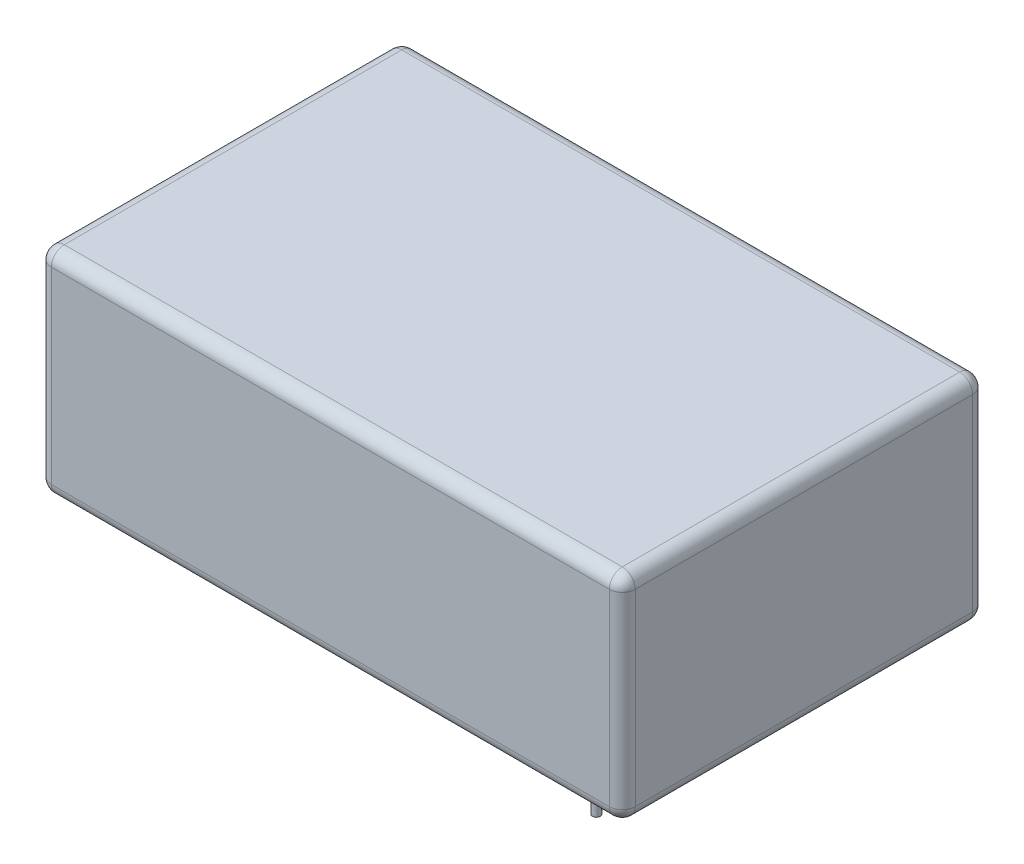
ISO-10303-21;
HEADER;
FILE_DESCRIPTION(('STEP AP214'),'2;1');
FILE_NAME('part.step','',(''),(''),'','','');
FILE_SCHEMA(('AUTOMOTIVE_DESIGN { 1 0 10303 214 1 1 1 1 }'));
ENDSEC;
DATA;
#1=APPLICATION_CONTEXT('core data for automotive mechanical design processes');
#2=APPLICATION_PROTOCOL_DEFINITION('international standard','automotive_design',2000,#1);
#3=PRODUCT_CONTEXT('',#1,'mechanical');
#4=PRODUCT('Part','Part','',(#3));
#5=PRODUCT_RELATED_PRODUCT_CATEGORY('part','',(#4));
#6=PRODUCT_DEFINITION_FORMATION('','',#4);
#7=PRODUCT_DEFINITION_CONTEXT('part definition',#1,'design');
#8=PRODUCT_DEFINITION('design','',#6,#7);
#9=PRODUCT_DEFINITION_SHAPE('','',#8);
#10=(LENGTH_UNIT() NAMED_UNIT(*) SI_UNIT(.MILLI.,.METRE.));
#11=(NAMED_UNIT(*) PLANE_ANGLE_UNIT() SI_UNIT($,.RADIAN.));
#12=(NAMED_UNIT(*) SI_UNIT($,.STERADIAN.) SOLID_ANGLE_UNIT());
#13=UNCERTAINTY_MEASURE_WITH_UNIT(LENGTH_MEASURE(1.E-05),#10,'distance_accuracy_value','');
#14=(GEOMETRIC_REPRESENTATION_CONTEXT(3) GLOBAL_UNCERTAINTY_ASSIGNED_CONTEXT((#13)) GLOBAL_UNIT_ASSIGNED_CONTEXT((#10,
#11,#12)) REPRESENTATION_CONTEXT('',''));
#15=CARTESIAN_POINT('',(0.,0.,0.));
#16=DIRECTION('',(0.,0.,1.));
#17=DIRECTION('',(1.,0.,0.));
#18=AXIS2_PLACEMENT_3D('',#15,#16,#17);
#19=CARTESIAN_POINT('',(0.,0.,28.));
#20=DIRECTION('',(1.,0.,0.));
#21=DIRECTION('',(0.,0.,-1.));
#22=AXIS2_PLACEMENT_3D('',#19,#20,#21);
#23=PLANE('',#22);
#24=DIRECTION('',(0.,-1.,0.));
#25=VECTOR('',#24,1.);
#26=CARTESIAN_POINT('',(0.,0.,1.));
#27=LINE('',#26,#25);
#28=CARTESIAN_POINT('',(0.,15.5,1.));
#29=VERTEX_POINT('',#28);
#30=CARTESIAN_POINT('',(0.,1.,1.));
#31=VERTEX_POINT('',#30);
#32=EDGE_CURVE('E234',#29,#31,#27,.T.);
#33=ORIENTED_EDGE('',*,*,#32,.T.);
#34=DIRECTION('',(0.,0.,-1.));
#35=VECTOR('',#34,1.);
#36=CARTESIAN_POINT('',(0.,1.,28.));
#37=LINE('',#36,#35);
#38=CARTESIAN_POINT('',(0.,1.,27.));
#39=VERTEX_POINT('',#38);
#40=EDGE_CURVE('E237',#31,#39,#37,.F.);
#41=ORIENTED_EDGE('',*,*,#40,.T.);
#42=DIRECTION('',(0.,-1.,0.));
#43=VECTOR('',#42,1.);
#44=CARTESIAN_POINT('',(0.,0.,27.));
#45=LINE('',#44,#43);
#46=CARTESIAN_POINT('',(0.,15.5,27.));
#47=VERTEX_POINT('',#46);
#48=EDGE_CURVE('E231',#39,#47,#45,.F.);
#49=ORIENTED_EDGE('',*,*,#48,.T.);
#50=DIRECTION('',(0.,0.,-1.));
#51=VECTOR('',#50,1.);
#52=CARTESIAN_POINT('',(0.,15.5,28.));
#53=LINE('',#52,#51);
#54=EDGE_CURVE('E228',#47,#29,#53,.T.);
#55=ORIENTED_EDGE('',*,*,#54,.T.);
#56=EDGE_LOOP('',(#33,#41,#49,#55));
#57=FACE_BOUND('',#56,.T.);
#58=ADVANCED_FACE('F37',(#57),#23,.F.);
#59=CARTESIAN_POINT('',(0.,0.,28.));
#60=DIRECTION('',(0.,1.,0.));
#61=DIRECTION('',(0.,0.,1.));
#62=AXIS2_PLACEMENT_3D('',#59,#60,#61);
#63=PLANE('',#62);
#64=CARTESIAN_POINT('',(6.,0.,19.));
#65=DIRECTION('',(0.,1.,0.));
#66=DIRECTION('',(0.,0.,1.));
#67=AXIS2_PLACEMENT_3D('',#64,#65,#66);
#68=CIRCLE('',#67,1.3);
#69=CARTESIAN_POINT('',(6.,0.,20.3));
#70=VERTEX_POINT('',#69);
#71=EDGE_CURVE('E188',#70,#70,#68,.T.);
#72=ORIENTED_EDGE('',*,*,#71,.T.);
#73=EDGE_LOOP('',(#72));
#74=FACE_BOUND('',#73,.T.);
#75=CARTESIAN_POINT('',(6.,0.,9.));
#76=DIRECTION('',(0.,1.,0.));
#77=DIRECTION('',(0.,0.,1.));
#78=AXIS2_PLACEMENT_3D('',#75,#76,#77);
#79=CIRCLE('',#78,1.3);
#80=CARTESIAN_POINT('',(6.,0.,10.3));
#81=VERTEX_POINT('',#80);
#82=EDGE_CURVE('E184',#81,#81,#79,.T.);
#83=ORIENTED_EDGE('',*,*,#82,.T.);
#84=EDGE_LOOP('',(#83));
#85=FACE_BOUND('',#84,.T.);
#86=CARTESIAN_POINT('',(39.,0.,24.));
#87=DIRECTION('',(0.,1.,0.));
#88=DIRECTION('',(0.,0.,1.));
#89=AXIS2_PLACEMENT_3D('',#86,#87,#88);
#90=CIRCLE('',#89,1.3);
#91=CARTESIAN_POINT('',(39.,0.,25.3));
#92=VERTEX_POINT('',#91);
#93=EDGE_CURVE('E175',#92,#92,#90,.T.);
#94=ORIENTED_EDGE('',*,*,#93,.T.);
#95=EDGE_LOOP('',(#94));
#96=FACE_BOUND('',#95,.T.);
#97=CARTESIAN_POINT('',(39.,0.,4.));
#98=DIRECTION('',(0.,1.,0.));
#99=DIRECTION('',(0.,0.,1.));
#100=AXIS2_PLACEMENT_3D('',#97,#98,#99);
#101=CIRCLE('',#100,1.3);
#102=CARTESIAN_POINT('',(39.,0.,5.3));
#103=VERTEX_POINT('',#102);
#104=EDGE_CURVE('E169',#103,#103,#101,.T.);
#105=ORIENTED_EDGE('',*,*,#104,.T.);
#106=EDGE_LOOP('',(#105));
#107=FACE_BOUND('',#106,.T.);
#108=DIRECTION('',(1.,0.,0.));
#109=VECTOR('',#108,1.);
#110=CARTESIAN_POINT('',(45.,0.,1.));
#111=LINE('',#110,#109);
#112=CARTESIAN_POINT('',(1.,0.,1.));
#113=VERTEX_POINT('',#112);
#114=CARTESIAN_POINT('',(44.,0.,1.));
#115=VERTEX_POINT('',#114);
#116=EDGE_CURVE('E166',#113,#115,#111,.T.);
#117=ORIENTED_EDGE('',*,*,#116,.T.);
#118=DIRECTION('',(0.,0.,-1.));
#119=VECTOR('',#118,1.);
#120=CARTESIAN_POINT('',(44.,0.,28.));
#121=LINE('',#120,#119);
#122=CARTESIAN_POINT('',(44.,0.,27.));
#123=VERTEX_POINT('',#122);
#124=EDGE_CURVE('E132',#115,#123,#121,.F.);
#125=ORIENTED_EDGE('',*,*,#124,.T.);
#126=DIRECTION('',(1.,0.,0.));
#127=VECTOR('',#126,1.);
#128=CARTESIAN_POINT('',(0.,0.,27.));
#129=LINE('',#128,#127);
#130=CARTESIAN_POINT('',(1.,0.,27.));
#131=VERTEX_POINT('',#130);
#132=EDGE_CURVE('E154',#123,#131,#129,.F.);
#133=ORIENTED_EDGE('',*,*,#132,.T.);
#134=DIRECTION('',(0.,0.,-1.));
#135=VECTOR('',#134,1.);
#136=CARTESIAN_POINT('',(1.,0.,28.));
#137=LINE('',#136,#135);
#138=EDGE_CURVE('E161',#131,#113,#137,.T.);
#139=ORIENTED_EDGE('',*,*,#138,.T.);
#140=EDGE_LOOP('',(#117,#125,#133,#139));
#141=FACE_BOUND('',#140,.T.);
#142=ADVANCED_FACE('F164',(#74,#85,#96,#107,#141),#63,.F.);
#143=CARTESIAN_POINT('',(45.,0.,28.));
#144=DIRECTION('',(-1.,0.,0.));
#145=DIRECTION('',(0.,0.,1.));
#146=AXIS2_PLACEMENT_3D('',#143,#144,#145);
#147=PLANE('',#146);
#148=DIRECTION('',(0.,1.,0.));
#149=VECTOR('',#148,1.);
#150=CARTESIAN_POINT('',(45.,0.,27.));
#151=LINE('',#150,#149);
#152=CARTESIAN_POINT('',(45.,15.5,27.));
#153=VERTEX_POINT('',#152);
#154=CARTESIAN_POINT('',(45.,1.,27.));
#155=VERTEX_POINT('',#154);
#156=EDGE_CURVE('E207',#153,#155,#151,.F.);
#157=ORIENTED_EDGE('',*,*,#156,.T.);
#158=DIRECTION('',(0.,0.,-1.));
#159=VECTOR('',#158,1.);
#160=CARTESIAN_POINT('',(45.,1.,28.));
#161=LINE('',#160,#159);
#162=CARTESIAN_POINT('',(45.,1.,1.));
#163=VERTEX_POINT('',#162);
#164=EDGE_CURVE('E135',#155,#163,#161,.T.);
#165=ORIENTED_EDGE('',*,*,#164,.T.);
#166=DIRECTION('',(0.,1.,0.));
#167=VECTOR('',#166,1.);
#168=CARTESIAN_POINT('',(45.,16.5,1.));
#169=LINE('',#168,#167);
#170=CARTESIAN_POINT('',(45.,15.5,1.));
#171=VERTEX_POINT('',#170);
#172=EDGE_CURVE('E210',#163,#171,#169,.T.);
#173=ORIENTED_EDGE('',*,*,#172,.T.);
#174=DIRECTION('',(0.,0.,-1.));
#175=VECTOR('',#174,1.);
#176=CARTESIAN_POINT('',(45.,15.5,28.));
#177=LINE('',#176,#175);
#178=EDGE_CURVE('E204',#171,#153,#177,.F.);
#179=ORIENTED_EDGE('',*,*,#178,.T.);
#180=EDGE_LOOP('',(#157,#165,#173,#179));
#181=FACE_BOUND('',#180,.T.);
#182=ADVANCED_FACE('F383',(#181),#147,.F.);
#183=CARTESIAN_POINT('',(0.,16.5,28.));
#184=DIRECTION('',(0.,-1.,0.));
#185=DIRECTION('',(0.,0.,-1.));
#186=AXIS2_PLACEMENT_3D('',#183,#184,#185);
#187=PLANE('',#186);
#188=DIRECTION('',(-1.,0.,0.));
#189=VECTOR('',#188,1.);
#190=CARTESIAN_POINT('',(0.,16.5,27.));
#191=LINE('',#190,#189);
#192=CARTESIAN_POINT('',(1.,16.5,27.));
#193=VERTEX_POINT('',#192);
#194=CARTESIAN_POINT('',(44.,16.5,27.));
#195=VERTEX_POINT('',#194);
#196=EDGE_CURVE('E47',#193,#195,#191,.F.);
#197=ORIENTED_EDGE('',*,*,#196,.T.);
#198=DIRECTION('',(0.,0.,-1.));
#199=VECTOR('',#198,1.);
#200=CARTESIAN_POINT('',(44.,16.5,28.));
#201=LINE('',#200,#199);
#202=CARTESIAN_POINT('',(44.,16.5,1.));
#203=VERTEX_POINT('',#202);
#204=EDGE_CURVE('E11',#195,#203,#201,.T.);
#205=ORIENTED_EDGE('',*,*,#204,.T.);
#206=DIRECTION('',(-1.,0.,0.));
#207=VECTOR('',#206,1.);
#208=CARTESIAN_POINT('',(0.,16.5,1.));
#209=LINE('',#208,#207);
#210=CARTESIAN_POINT('',(1.,16.5,1.));
#211=VERTEX_POINT('',#210);
#212=EDGE_CURVE('E253',#203,#211,#209,.T.);
#213=ORIENTED_EDGE('',*,*,#212,.T.);
#214=DIRECTION('',(0.,0.,-1.));
#215=VECTOR('',#214,1.);
#216=CARTESIAN_POINT('',(1.,16.5,28.));
#217=LINE('',#216,#215);
#218=EDGE_CURVE('E58',#211,#193,#217,.F.);
#219=ORIENTED_EDGE('',*,*,#218,.T.);
#220=EDGE_LOOP('',(#197,#205,#213,#219));
#221=FACE_BOUND('',#220,.T.);
#222=ADVANCED_FACE('F468',(#221),#187,.F.);
#223=CARTESIAN_POINT('',(0.,0.,28.));
#224=DIRECTION('',(0.,0.,-1.));
#225=DIRECTION('',(-1.,0.,0.));
#226=AXIS2_PLACEMENT_3D('',#223,#224,#225);
#227=PLANE('',#226);
#228=DIRECTION('',(1.,0.,0.));
#229=VECTOR('',#228,1.);
#230=CARTESIAN_POINT('',(0.,1.,28.));
#231=LINE('',#230,#229);
#232=CARTESIAN_POINT('',(1.,1.,28.));
#233=VERTEX_POINT('',#232);
#234=CARTESIAN_POINT('',(44.,1.,28.));
#235=VERTEX_POINT('',#234);
#236=EDGE_CURVE('E246',#233,#235,#231,.T.);
#237=ORIENTED_EDGE('',*,*,#236,.T.);
#238=DIRECTION('',(0.,1.,0.));
#239=VECTOR('',#238,1.);
#240=CARTESIAN_POINT('',(44.,0.,28.));
#241=LINE('',#240,#239);
#242=CARTESIAN_POINT('',(44.,15.5,28.));
#243=VERTEX_POINT('',#242);
#244=EDGE_CURVE('E249',#235,#243,#241,.T.);
#245=ORIENTED_EDGE('',*,*,#244,.T.);
#246=DIRECTION('',(-1.,0.,0.));
#247=VECTOR('',#246,1.);
#248=CARTESIAN_POINT('',(0.,15.5,28.));
#249=LINE('',#248,#247);
#250=CARTESIAN_POINT('',(1.,15.5,28.));
#251=VERTEX_POINT('',#250);
#252=EDGE_CURVE('E241',#243,#251,#249,.T.);
#253=ORIENTED_EDGE('',*,*,#252,.T.);
#254=DIRECTION('',(0.,-1.,0.));
#255=VECTOR('',#254,1.);
#256=CARTESIAN_POINT('',(1.,0.,28.));
#257=LINE('',#256,#255);
#258=EDGE_CURVE('E244',#251,#233,#257,.T.);
#259=ORIENTED_EDGE('',*,*,#258,.T.);
#260=EDGE_LOOP('',(#237,#245,#253,#259));
#261=FACE_BOUND('',#260,.T.);
#262=ADVANCED_FACE('F391',(#261),#227,.F.);
#263=CARTESIAN_POINT('',(0.,0.,0.));
#264=DIRECTION('',(0.,0.,-1.));
#265=DIRECTION('',(-1.,0.,0.));
#266=AXIS2_PLACEMENT_3D('',#263,#264,#265);
#267=PLANE('',#266);
#268=DIRECTION('',(0.,1.,0.));
#269=VECTOR('',#268,1.);
#270=CARTESIAN_POINT('',(44.,0.,0.));
#271=LINE('',#270,#269);
#272=CARTESIAN_POINT('',(44.,15.5,0.));
#273=VERTEX_POINT('',#272);
#274=CARTESIAN_POINT('',(44.,1.,0.));
#275=VERTEX_POINT('',#274);
#276=EDGE_CURVE('E221',#273,#275,#271,.F.);
#277=ORIENTED_EDGE('',*,*,#276,.T.);
#278=DIRECTION('',(1.,0.,0.));
#279=VECTOR('',#278,1.);
#280=CARTESIAN_POINT('',(0.,1.,0.));
#281=LINE('',#280,#279);
#282=CARTESIAN_POINT('',(1.,1.,0.));
#283=VERTEX_POINT('',#282);
#284=EDGE_CURVE('E224',#275,#283,#281,.F.);
#285=ORIENTED_EDGE('',*,*,#284,.T.);
#286=DIRECTION('',(0.,-1.,0.));
#287=VECTOR('',#286,1.);
#288=CARTESIAN_POINT('',(1.,16.5,0.));
#289=LINE('',#288,#287);
#290=CARTESIAN_POINT('',(1.,15.5,0.));
#291=VERTEX_POINT('',#290);
#292=EDGE_CURVE('E218',#283,#291,#289,.F.);
#293=ORIENTED_EDGE('',*,*,#292,.T.);
#294=DIRECTION('',(-1.,0.,0.));
#295=VECTOR('',#294,1.);
#296=CARTESIAN_POINT('',(45.,15.5,0.));
#297=LINE('',#296,#295);
#298=EDGE_CURVE('E215',#291,#273,#297,.F.);
#299=ORIENTED_EDGE('',*,*,#298,.T.);
#300=EDGE_LOOP('',(#277,#285,#293,#299));
#301=FACE_BOUND('',#300,.T.);
#302=ADVANCED_FACE('F475',(#301),#267,.T.);
#303=CARTESIAN_POINT('',(6.,-4.,19.));
#304=DIRECTION('',(0.,1.,0.));
#305=DIRECTION('',(0.,0.,1.));
#306=AXIS2_PLACEMENT_3D('',#303,#304,#305);
#307=CYLINDRICAL_SURFACE('',#306,0.300000000000002);
#308=CARTESIAN_POINT('',(6.,-0.999999999999998,19.));
#309=DIRECTION('',(0.,1.,0.));
#310=DIRECTION('',(0.,0.,1.));
#311=AXIS2_PLACEMENT_3D('',#308,#309,#310);
#312=CIRCLE('',#311,0.300000000000002);
#313=CARTESIAN_POINT('',(6.,-0.999999999999998,19.3));
#314=VERTEX_POINT('',#313);
#315=EDGE_CURVE('E162',#314,#314,#312,.F.);
#316=ORIENTED_EDGE('',*,*,#315,.T.);
#317=EDGE_LOOP('',(#316));
#318=FACE_BOUND('',#317,.T.);
#319=CARTESIAN_POINT('',(6.,-4.,19.));
#320=DIRECTION('',(0.,-1.,0.));
#321=DIRECTION('',(0.,0.,-1.));
#322=AXIS2_PLACEMENT_3D('',#319,#320,#321);
#323=CIRCLE('',#322,0.300000000000002);
#324=CARTESIAN_POINT('',(6.,-4.,18.7));
#325=VERTEX_POINT('',#324);
#326=EDGE_CURVE('E354',#325,#325,#323,.T.);
#327=ORIENTED_EDGE('',*,*,#326,.F.);
#328=EDGE_LOOP('',(#327));
#329=FACE_BOUND('',#328,.T.);
#330=ADVANCED_FACE('F479',(#318,#329),#307,.T.);
#331=CARTESIAN_POINT('',(6.,-4.,19.));
#332=DIRECTION('',(0.,-1.,0.));
#333=DIRECTION('',(0.,0.,-1.));
#334=AXIS2_PLACEMENT_3D('',#331,#332,#333);
#335=PLANE('',#334);
#336=ORIENTED_EDGE('',*,*,#326,.T.);
#337=EDGE_LOOP('',(#336));
#338=FACE_BOUND('',#337,.T.);
#339=ADVANCED_FACE('F484',(#338),#335,.T.);
#340=CARTESIAN_POINT('',(6.,-4.,9.));
#341=DIRECTION('',(0.,1.,0.));
#342=DIRECTION('',(0.,0.,1.));
#343=AXIS2_PLACEMENT_3D('',#340,#341,#342);
#344=CYLINDRICAL_SURFACE('',#343,0.3);
#345=CARTESIAN_POINT('',(6.,-0.999999999999998,9.));
#346=DIRECTION('',(0.,1.,0.));
#347=DIRECTION('',(0.,0.,1.));
#348=AXIS2_PLACEMENT_3D('',#345,#346,#347);
#349=CIRCLE('',#348,0.3);
#350=CARTESIAN_POINT('',(6.,-0.999999999999998,9.3));
#351=VERTEX_POINT('',#350);
#352=EDGE_CURVE('E192',#351,#351,#349,.F.);
#353=ORIENTED_EDGE('',*,*,#352,.T.);
#354=EDGE_LOOP('',(#353));
#355=FACE_BOUND('',#354,.T.);
#356=CARTESIAN_POINT('',(6.,-4.,9.));
#357=DIRECTION('',(0.,-1.,0.));
#358=DIRECTION('',(0.,0.,-1.));
#359=AXIS2_PLACEMENT_3D('',#356,#357,#358);
#360=CIRCLE('',#359,0.3);
#361=CARTESIAN_POINT('',(6.,-4.,8.7));
#362=VERTEX_POINT('',#361);
#363=EDGE_CURVE('E348',#362,#362,#360,.T.);
#364=ORIENTED_EDGE('',*,*,#363,.F.);
#365=EDGE_LOOP('',(#364));
#366=FACE_BOUND('',#365,.T.);
#367=ADVANCED_FACE('F488',(#355,#366),#344,.T.);
#368=CARTESIAN_POINT('',(6.,-4.,9.));
#369=DIRECTION('',(0.,-1.,0.));
#370=DIRECTION('',(0.,0.,-1.));
#371=AXIS2_PLACEMENT_3D('',#368,#369,#370);
#372=PLANE('',#371);
#373=ORIENTED_EDGE('',*,*,#363,.T.);
#374=EDGE_LOOP('',(#373));
#375=FACE_BOUND('',#374,.T.);
#376=ADVANCED_FACE('F492',(#375),#372,.T.);
#377=CARTESIAN_POINT('',(39.,-4.,24.));
#378=DIRECTION('',(0.,1.,0.));
#379=DIRECTION('',(0.,0.,1.));
#380=AXIS2_PLACEMENT_3D('',#377,#378,#379);
#381=CYLINDRICAL_SURFACE('',#380,0.300000000000004);
#382=CARTESIAN_POINT('',(39.,-0.999999999999998,24.));
#383=DIRECTION('',(0.,1.,0.));
#384=DIRECTION('',(0.,0.,1.));
#385=AXIS2_PLACEMENT_3D('',#382,#383,#384);
#386=CIRCLE('',#385,0.300000000000004);
#387=CARTESIAN_POINT('',(39.,-0.999999999999998,24.3));
#388=VERTEX_POINT('',#387);
#389=EDGE_CURVE('E196',#388,#388,#386,.F.);
#390=ORIENTED_EDGE('',*,*,#389,.T.);
#391=EDGE_LOOP('',(#390));
#392=FACE_BOUND('',#391,.T.);
#393=CARTESIAN_POINT('',(39.,-4.,24.));
#394=DIRECTION('',(0.,-1.,0.));
#395=DIRECTION('',(0.,0.,-1.));
#396=AXIS2_PLACEMENT_3D('',#393,#394,#395);
#397=CIRCLE('',#396,0.300000000000004);
#398=CARTESIAN_POINT('',(39.,-4.,23.7));
#399=VERTEX_POINT('',#398);
#400=EDGE_CURVE('E342',#399,#399,#397,.T.);
#401=ORIENTED_EDGE('',*,*,#400,.F.);
#402=EDGE_LOOP('',(#401));
#403=FACE_BOUND('',#402,.T.);
#404=ADVANCED_FACE('F496',(#392,#403),#381,.T.);
#405=CARTESIAN_POINT('',(39.,-4.,24.));
#406=DIRECTION('',(0.,-1.,0.));
#407=DIRECTION('',(0.,0.,-1.));
#408=AXIS2_PLACEMENT_3D('',#405,#406,#407);
#409=PLANE('',#408);
#410=ORIENTED_EDGE('',*,*,#400,.T.);
#411=EDGE_LOOP('',(#410));
#412=FACE_BOUND('',#411,.T.);
#413=ADVANCED_FACE('F500',(#412),#409,.T.);
#414=CARTESIAN_POINT('',(39.,-4.,4.));
#415=DIRECTION('',(0.,1.,0.));
#416=DIRECTION('',(0.,0.,1.));
#417=AXIS2_PLACEMENT_3D('',#414,#415,#416);
#418=CYLINDRICAL_SURFACE('',#417,0.300000000000004);
#419=CARTESIAN_POINT('',(39.,-0.999999999999998,4.));
#420=DIRECTION('',(0.,1.,0.));
#421=DIRECTION('',(0.,0.,1.));
#422=AXIS2_PLACEMENT_3D('',#419,#420,#421);
#423=CIRCLE('',#422,0.300000000000004);
#424=CARTESIAN_POINT('',(39.,-0.999999999999998,4.3));
#425=VERTEX_POINT('',#424);
#426=EDGE_CURVE('E200',#425,#425,#423,.F.);
#427=ORIENTED_EDGE('',*,*,#426,.T.);
#428=EDGE_LOOP('',(#427));
#429=FACE_BOUND('',#428,.T.);
#430=CARTESIAN_POINT('',(39.,-4.,4.));
#431=DIRECTION('',(0.,-1.,0.));
#432=DIRECTION('',(0.,0.,-1.));
#433=AXIS2_PLACEMENT_3D('',#430,#431,#432);
#434=CIRCLE('',#433,0.300000000000004);
#435=CARTESIAN_POINT('',(39.,-4.,3.7));
#436=VERTEX_POINT('',#435);
#437=EDGE_CURVE('E336',#436,#436,#434,.T.);
#438=ORIENTED_EDGE('',*,*,#437,.F.);
#439=EDGE_LOOP('',(#438));
#440=FACE_BOUND('',#439,.T.);
#441=ADVANCED_FACE('F504',(#429,#440),#418,.T.);
#442=CARTESIAN_POINT('',(39.,-4.,4.));
#443=DIRECTION('',(0.,-1.,0.));
#444=DIRECTION('',(0.,0.,-1.));
#445=AXIS2_PLACEMENT_3D('',#442,#443,#444);
#446=PLANE('',#445);
#447=ORIENTED_EDGE('',*,*,#437,.T.);
#448=EDGE_LOOP('',(#447));
#449=FACE_BOUND('',#448,.T.);
#450=ADVANCED_FACE('F426',(#449),#446,.T.);
#451=CARTESIAN_POINT('',(6.,-1.,19.));
#452=DIRECTION('',(0.,1.,0.));
#453=DIRECTION('',(0.,0.,1.));
#454=AXIS2_PLACEMENT_3D('',#451,#452,#453);
#455=TOROIDAL_SURFACE('',#454,1.3,1.);
#456=ORIENTED_EDGE('',*,*,#71,.F.);
#457=EDGE_LOOP('',(#456));
#458=FACE_BOUND('',#457,.T.);
#459=ORIENTED_EDGE('',*,*,#315,.F.);
#460=EDGE_LOOP('',(#459));
#461=FACE_BOUND('',#460,.T.);
#462=ADVANCED_FACE('F422',(#458,#461),#455,.F.);
#463=CARTESIAN_POINT('',(6.,-1.,9.));
#464=DIRECTION('',(0.,1.,0.));
#465=DIRECTION('',(0.,0.,1.));
#466=AXIS2_PLACEMENT_3D('',#463,#464,#465);
#467=TOROIDAL_SURFACE('',#466,1.3,1.);
#468=ORIENTED_EDGE('',*,*,#82,.F.);
#469=EDGE_LOOP('',(#468));
#470=FACE_BOUND('',#469,.T.);
#471=ORIENTED_EDGE('',*,*,#352,.F.);
#472=EDGE_LOOP('',(#471));
#473=FACE_BOUND('',#472,.T.);
#474=ADVANCED_FACE('F425',(#470,#473),#467,.F.);
#475=CARTESIAN_POINT('',(39.,-1.,24.));
#476=DIRECTION('',(0.,1.,0.));
#477=DIRECTION('',(0.,0.,1.));
#478=AXIS2_PLACEMENT_3D('',#475,#476,#477);
#479=TOROIDAL_SURFACE('',#478,1.3,1.);
#480=ORIENTED_EDGE('',*,*,#93,.F.);
#481=EDGE_LOOP('',(#480));
#482=FACE_BOUND('',#481,.T.);
#483=ORIENTED_EDGE('',*,*,#389,.F.);
#484=EDGE_LOOP('',(#483));
#485=FACE_BOUND('',#484,.T.);
#486=ADVANCED_FACE('F430',(#482,#485),#479,.F.);
#487=CARTESIAN_POINT('',(39.,-1.,4.));
#488=DIRECTION('',(0.,1.,0.));
#489=DIRECTION('',(0.,0.,1.));
#490=AXIS2_PLACEMENT_3D('',#487,#488,#489);
#491=TOROIDAL_SURFACE('',#490,1.3,1.);
#492=ORIENTED_EDGE('',*,*,#104,.F.);
#493=EDGE_LOOP('',(#492));
#494=FACE_BOUND('',#493,.T.);
#495=ORIENTED_EDGE('',*,*,#426,.F.);
#496=EDGE_LOOP('',(#495));
#497=FACE_BOUND('',#496,.T.);
#498=ADVANCED_FACE('F434',(#494,#497),#491,.F.);
#499=CARTESIAN_POINT('',(1.,15.5,28.));
#500=DIRECTION('',(0.,0.,-1.));
#501=DIRECTION('',(-1.,0.,0.));
#502=AXIS2_PLACEMENT_3D('',#499,#500,#501);
#503=CYLINDRICAL_SURFACE('',#502,1.);
#504=CARTESIAN_POINT('',(1.,15.5,27.));
#505=DIRECTION('',(0.,0.,1.));
#506=DIRECTION('',(1.,0.,0.));
#507=AXIS2_PLACEMENT_3D('',#504,#505,#506);
#508=CIRCLE('',#507,1.);
#509=EDGE_CURVE('E41',#193,#47,#508,.T.);
#510=ORIENTED_EDGE('',*,*,#509,.F.);
#511=ORIENTED_EDGE('',*,*,#218,.F.);
#512=CARTESIAN_POINT('',(1.,15.5,1.));
#513=DIRECTION('',(0.,0.,-1.));
#514=DIRECTION('',(-1.,0.,0.));
#515=AXIS2_PLACEMENT_3D('',#512,#513,#514);
#516=CIRCLE('',#515,1.);
#517=EDGE_CURVE('E327',#29,#211,#516,.T.);
#518=ORIENTED_EDGE('',*,*,#517,.F.);
#519=ORIENTED_EDGE('',*,*,#54,.F.);
#520=EDGE_LOOP('',(#510,#511,#518,#519));
#521=FACE_BOUND('',#520,.T.);
#522=ADVANCED_FACE('F39',(#521),#503,.T.);
#523=CARTESIAN_POINT('',(1.,15.5,27.));
#524=DIRECTION('',(0.,0.,1.));
#525=DIRECTION('',(1.,0.,0.));
#526=AXIS2_PLACEMENT_3D('',#523,#524,#525);
#527=SPHERICAL_SURFACE('',#526,1.);
#528=CARTESIAN_POINT('',(1.,15.5,27.));
#529=DIRECTION('',(-1.,0.,0.));
#530=DIRECTION('',(0.,0.,1.));
#531=AXIS2_PLACEMENT_3D('',#528,#529,#530);
#532=CIRCLE('',#531,1.);
#533=EDGE_CURVE('E320',#193,#251,#532,.F.);
#534=ORIENTED_EDGE('',*,*,#533,.F.);
#535=ORIENTED_EDGE('',*,*,#509,.T.);
#536=CARTESIAN_POINT('',(1.,15.5,27.));
#537=DIRECTION('',(0.,1.,0.));
#538=DIRECTION('',(0.,0.,1.));
#539=AXIS2_PLACEMENT_3D('',#536,#537,#538);
#540=CIRCLE('',#539,1.);
#541=EDGE_CURVE('E324',#251,#47,#540,.F.);
#542=ORIENTED_EDGE('',*,*,#541,.F.);
#543=EDGE_LOOP('',(#534,#535,#542));
#544=FACE_BOUND('',#543,.T.);
#545=ADVANCED_FACE('F531',(#544),#527,.T.);
#546=CARTESIAN_POINT('',(1.,15.5,1.));
#547=DIRECTION('',(0.,0.,1.));
#548=DIRECTION('',(1.,0.,0.));
#549=AXIS2_PLACEMENT_3D('',#546,#547,#548);
#550=SPHERICAL_SURFACE('',#549,1.);
#551=CARTESIAN_POINT('',(1.,15.5,1.));
#552=DIRECTION('',(0.,1.,0.));
#553=DIRECTION('',(0.,0.,1.));
#554=AXIS2_PLACEMENT_3D('',#551,#552,#553);
#555=CIRCLE('',#554,1.);
#556=EDGE_CURVE('E312',#29,#291,#555,.F.);
#557=ORIENTED_EDGE('',*,*,#556,.F.);
#558=ORIENTED_EDGE('',*,*,#517,.T.);
#559=CARTESIAN_POINT('',(1.,15.5,1.));
#560=DIRECTION('',(-1.,0.,0.));
#561=DIRECTION('',(0.,0.,1.));
#562=AXIS2_PLACEMENT_3D('',#559,#560,#561);
#563=CIRCLE('',#562,1.);
#564=EDGE_CURVE('E316',#291,#211,#563,.F.);
#565=ORIENTED_EDGE('',*,*,#564,.F.);
#566=EDGE_LOOP('',(#557,#558,#565));
#567=FACE_BOUND('',#566,.T.);
#568=ADVANCED_FACE('F537',(#567),#550,.T.);
#569=CARTESIAN_POINT('',(1.,0.,27.));
#570=DIRECTION('',(0.,-1.,0.));
#571=DIRECTION('',(0.,0.,-1.));
#572=AXIS2_PLACEMENT_3D('',#569,#570,#571);
#573=CYLINDRICAL_SURFACE('',#572,1.);
#574=ORIENTED_EDGE('',*,*,#541,.T.);
#575=ORIENTED_EDGE('',*,*,#48,.F.);
#576=CARTESIAN_POINT('',(1.,1.,27.));
#577=DIRECTION('',(0.,-1.,0.));
#578=DIRECTION('',(0.,0.,-1.));
#579=AXIS2_PLACEMENT_3D('',#576,#577,#578);
#580=CIRCLE('',#579,1.);
#581=EDGE_CURVE('E305',#233,#39,#580,.T.);
#582=ORIENTED_EDGE('',*,*,#581,.F.);
#583=ORIENTED_EDGE('',*,*,#258,.F.);
#584=EDGE_LOOP('',(#574,#575,#582,#583));
#585=FACE_BOUND('',#584,.T.);
#586=ADVANCED_FACE('F397',(#585),#573,.T.);
#587=CARTESIAN_POINT('',(0.,15.5,27.));
#588=DIRECTION('',(-1.,0.,0.));
#589=DIRECTION('',(0.,0.,1.));
#590=AXIS2_PLACEMENT_3D('',#587,#588,#589);
#591=CYLINDRICAL_SURFACE('',#590,1.);
#592=ORIENTED_EDGE('',*,*,#533,.T.);
#593=ORIENTED_EDGE('',*,*,#252,.F.);
#594=CARTESIAN_POINT('',(44.,15.5,27.));
#595=DIRECTION('',(1.,0.,0.));
#596=DIRECTION('',(0.,0.,-1.));
#597=AXIS2_PLACEMENT_3D('',#594,#595,#596);
#598=CIRCLE('',#597,1.);
#599=EDGE_CURVE('E301',#195,#243,#598,.T.);
#600=ORIENTED_EDGE('',*,*,#599,.F.);
#601=ORIENTED_EDGE('',*,*,#196,.F.);
#602=EDGE_LOOP('',(#592,#593,#600,#601));
#603=FACE_BOUND('',#602,.T.);
#604=ADVANCED_FACE('F547',(#603),#591,.T.);
#605=CARTESIAN_POINT('',(44.,15.5,28.));
#606=DIRECTION('',(0.,0.,-1.));
#607=DIRECTION('',(-1.,0.,0.));
#608=AXIS2_PLACEMENT_3D('',#605,#606,#607);
#609=CYLINDRICAL_SURFACE('',#608,1.);
#610=CARTESIAN_POINT('',(44.,15.5,1.));
#611=DIRECTION('',(0.,0.,-1.));
#612=DIRECTION('',(-1.,0.,0.));
#613=AXIS2_PLACEMENT_3D('',#610,#611,#612);
#614=CIRCLE('',#613,1.);
#615=EDGE_CURVE('E293',#203,#171,#614,.T.);
#616=ORIENTED_EDGE('',*,*,#615,.F.);
#617=ORIENTED_EDGE('',*,*,#204,.F.);
#618=CARTESIAN_POINT('',(44.,15.5,27.));
#619=DIRECTION('',(0.,0.,1.));
#620=DIRECTION('',(1.,0.,0.));
#621=AXIS2_PLACEMENT_3D('',#618,#619,#620);
#622=CIRCLE('',#621,1.);
#623=EDGE_CURVE('E297',#153,#195,#622,.T.);
#624=ORIENTED_EDGE('',*,*,#623,.F.);
#625=ORIENTED_EDGE('',*,*,#178,.F.);
#626=EDGE_LOOP('',(#616,#617,#624,#625));
#627=FACE_BOUND('',#626,.T.);
#628=ADVANCED_FACE('F465',(#627),#609,.T.);
#629=CARTESIAN_POINT('',(0.,15.5,1.));
#630=DIRECTION('',(1.,0.,0.));
#631=DIRECTION('',(0.,0.,-1.));
#632=AXIS2_PLACEMENT_3D('',#629,#630,#631);
#633=CYLINDRICAL_SURFACE('',#632,1.);
#634=ORIENTED_EDGE('',*,*,#564,.T.);
#635=ORIENTED_EDGE('',*,*,#212,.F.);
#636=CARTESIAN_POINT('',(44.,15.5,1.));
#637=DIRECTION('',(1.,0.,0.));
#638=DIRECTION('',(0.,0.,-1.));
#639=AXIS2_PLACEMENT_3D('',#636,#637,#638);
#640=CIRCLE('',#639,1.);
#641=EDGE_CURVE('E290',#273,#203,#640,.T.);
#642=ORIENTED_EDGE('',*,*,#641,.F.);
#643=ORIENTED_EDGE('',*,*,#298,.F.);
#644=EDGE_LOOP('',(#634,#635,#642,#643));
#645=FACE_BOUND('',#644,.T.);
#646=ADVANCED_FACE('F467',(#645),#633,.T.);
#647=CARTESIAN_POINT('',(1.,0.,1.));
#648=DIRECTION('',(0.,1.,0.));
#649=DIRECTION('',(0.,0.,1.));
#650=AXIS2_PLACEMENT_3D('',#647,#648,#649);
#651=CYLINDRICAL_SURFACE('',#650,1.);
#652=ORIENTED_EDGE('',*,*,#556,.T.);
#653=ORIENTED_EDGE('',*,*,#292,.F.);
#654=CARTESIAN_POINT('',(1.,1.,1.));
#655=DIRECTION('',(0.,-1.,0.));
#656=DIRECTION('',(0.,0.,-1.));
#657=AXIS2_PLACEMENT_3D('',#654,#655,#656);
#658=CIRCLE('',#657,1.);
#659=EDGE_CURVE('E286',#31,#283,#658,.T.);
#660=ORIENTED_EDGE('',*,*,#659,.F.);
#661=ORIENTED_EDGE('',*,*,#32,.F.);
#662=EDGE_LOOP('',(#652,#653,#660,#661));
#663=FACE_BOUND('',#662,.T.);
#664=ADVANCED_FACE('F410',(#663),#651,.T.);
#665=CARTESIAN_POINT('',(1.,1.,28.));
#666=DIRECTION('',(0.,0.,-1.));
#667=DIRECTION('',(-1.,0.,0.));
#668=AXIS2_PLACEMENT_3D('',#665,#666,#667);
#669=CYLINDRICAL_SURFACE('',#668,1.);
#670=CARTESIAN_POINT('',(1.,1.,27.));
#671=DIRECTION('',(0.,0.,1.));
#672=DIRECTION('',(1.,0.,0.));
#673=AXIS2_PLACEMENT_3D('',#670,#671,#672);
#674=CIRCLE('',#673,1.);
#675=EDGE_CURVE('E308',#39,#131,#674,.T.);
#676=ORIENTED_EDGE('',*,*,#675,.F.);
#677=ORIENTED_EDGE('',*,*,#40,.F.);
#678=CARTESIAN_POINT('',(1.,1.,1.));
#679=DIRECTION('',(0.,0.,-1.));
#680=DIRECTION('',(-1.,0.,0.));
#681=AXIS2_PLACEMENT_3D('',#678,#679,#680);
#682=CIRCLE('',#681,1.);
#683=EDGE_CURVE('E282',#113,#31,#682,.T.);
#684=ORIENTED_EDGE('',*,*,#683,.F.);
#685=ORIENTED_EDGE('',*,*,#138,.F.);
#686=EDGE_LOOP('',(#676,#677,#684,#685));
#687=FACE_BOUND('',#686,.T.);
#688=ADVANCED_FACE('F365',(#687),#669,.T.);
#689=CARTESIAN_POINT('',(1.,1.,27.));
#690=DIRECTION('',(0.,0.,1.));
#691=DIRECTION('',(1.,0.,0.));
#692=AXIS2_PLACEMENT_3D('',#689,#690,#691);
#693=SPHERICAL_SURFACE('',#692,1.);
#694=ORIENTED_EDGE('',*,*,#581,.T.);
#695=ORIENTED_EDGE('',*,*,#675,.T.);
#696=CARTESIAN_POINT('',(1.,1.,27.));
#697=DIRECTION('',(-1.,0.,0.));
#698=DIRECTION('',(0.,0.,1.));
#699=AXIS2_PLACEMENT_3D('',#696,#697,#698);
#700=CIRCLE('',#699,1.);
#701=EDGE_CURVE('E157',#233,#131,#700,.F.);
#702=ORIENTED_EDGE('',*,*,#701,.F.);
#703=EDGE_LOOP('',(#694,#695,#702));
#704=FACE_BOUND('',#703,.T.);
#705=ADVANCED_FACE('F399',(#704),#693,.T.);
#706=CARTESIAN_POINT('',(44.,15.5,27.));
#707=DIRECTION('',(0.,0.,1.));
#708=DIRECTION('',(1.,0.,0.));
#709=AXIS2_PLACEMENT_3D('',#706,#707,#708);
#710=SPHERICAL_SURFACE('',#709,1.);
#711=ORIENTED_EDGE('',*,*,#623,.T.);
#712=ORIENTED_EDGE('',*,*,#599,.T.);
#713=CARTESIAN_POINT('',(44.,15.5,27.));
#714=DIRECTION('',(0.,1.,0.));
#715=DIRECTION('',(0.,0.,1.));
#716=AXIS2_PLACEMENT_3D('',#713,#714,#715);
#717=CIRCLE('',#716,1.);
#718=EDGE_CURVE('E277',#153,#243,#717,.F.);
#719=ORIENTED_EDGE('',*,*,#718,.F.);
#720=EDGE_LOOP('',(#711,#712,#719));
#721=FACE_BOUND('',#720,.T.);
#722=ADVANCED_FACE('F401',(#721),#710,.T.);
#723=CARTESIAN_POINT('',(44.,15.5,1.));
#724=DIRECTION('',(0.,0.,1.));
#725=DIRECTION('',(1.,0.,0.));
#726=AXIS2_PLACEMENT_3D('',#723,#724,#725);
#727=SPHERICAL_SURFACE('',#726,1.);
#728=ORIENTED_EDGE('',*,*,#641,.T.);
#729=ORIENTED_EDGE('',*,*,#615,.T.);
#730=CARTESIAN_POINT('',(44.,15.5,1.));
#731=DIRECTION('',(0.,1.,0.));
#732=DIRECTION('',(0.,0.,1.));
#733=AXIS2_PLACEMENT_3D('',#730,#731,#732);
#734=CIRCLE('',#733,1.);
#735=EDGE_CURVE('E273',#273,#171,#734,.F.);
#736=ORIENTED_EDGE('',*,*,#735,.F.);
#737=EDGE_LOOP('',(#728,#729,#736));
#738=FACE_BOUND('',#737,.T.);
#739=ADVANCED_FACE('F407',(#738),#727,.T.);
#740=CARTESIAN_POINT('',(1.,1.,1.));
#741=DIRECTION('',(0.,0.,1.));
#742=DIRECTION('',(1.,0.,0.));
#743=AXIS2_PLACEMENT_3D('',#740,#741,#742);
#744=SPHERICAL_SURFACE('',#743,1.);
#745=ORIENTED_EDGE('',*,*,#683,.T.);
#746=ORIENTED_EDGE('',*,*,#659,.T.);
#747=CARTESIAN_POINT('',(1.,1.,1.));
#748=DIRECTION('',(-1.,0.,0.));
#749=DIRECTION('',(0.,0.,1.));
#750=AXIS2_PLACEMENT_3D('',#747,#748,#749);
#751=CIRCLE('',#750,1.);
#752=EDGE_CURVE('E151',#113,#283,#751,.F.);
#753=ORIENTED_EDGE('',*,*,#752,.F.);
#754=EDGE_LOOP('',(#745,#746,#753));
#755=FACE_BOUND('',#754,.T.);
#756=ADVANCED_FACE('F368',(#755),#744,.T.);
#757=CARTESIAN_POINT('',(0.,1.,27.));
#758=DIRECTION('',(1.,0.,0.));
#759=DIRECTION('',(0.,0.,-1.));
#760=AXIS2_PLACEMENT_3D('',#757,#758,#759);
#761=CYLINDRICAL_SURFACE('',#760,1.);
#762=ORIENTED_EDGE('',*,*,#701,.T.);
#763=ORIENTED_EDGE('',*,*,#132,.F.);
#764=CARTESIAN_POINT('',(44.,1.,27.));
#765=DIRECTION('',(1.,0.,0.));
#766=DIRECTION('',(0.,0.,-1.));
#767=AXIS2_PLACEMENT_3D('',#764,#765,#766);
#768=CIRCLE('',#767,1.);
#769=EDGE_CURVE('E143',#235,#123,#768,.T.);
#770=ORIENTED_EDGE('',*,*,#769,.F.);
#771=ORIENTED_EDGE('',*,*,#236,.F.);
#772=EDGE_LOOP('',(#762,#763,#770,#771));
#773=FACE_BOUND('',#772,.T.);
#774=ADVANCED_FACE('F155',(#773),#761,.T.);
#775=CARTESIAN_POINT('',(44.,0.,27.));
#776=DIRECTION('',(0.,1.,0.));
#777=DIRECTION('',(0.,0.,1.));
#778=AXIS2_PLACEMENT_3D('',#775,#776,#777);
#779=CYLINDRICAL_SURFACE('',#778,1.);
#780=ORIENTED_EDGE('',*,*,#718,.T.);
#781=ORIENTED_EDGE('',*,*,#244,.F.);
#782=CARTESIAN_POINT('',(44.,1.,27.));
#783=DIRECTION('',(0.,-1.,0.));
#784=DIRECTION('',(0.,0.,-1.));
#785=AXIS2_PLACEMENT_3D('',#782,#783,#784);
#786=CIRCLE('',#785,1.);
#787=EDGE_CURVE('E147',#155,#235,#786,.T.);
#788=ORIENTED_EDGE('',*,*,#787,.F.);
#789=ORIENTED_EDGE('',*,*,#156,.F.);
#790=EDGE_LOOP('',(#780,#781,#788,#789));
#791=FACE_BOUND('',#790,.T.);
#792=ADVANCED_FACE('F388',(#791),#779,.T.);
#793=CARTESIAN_POINT('',(44.,0.,1.));
#794=DIRECTION('',(0.,-1.,0.));
#795=DIRECTION('',(0.,0.,-1.));
#796=AXIS2_PLACEMENT_3D('',#793,#794,#795);
#797=CYLINDRICAL_SURFACE('',#796,1.);
#798=ORIENTED_EDGE('',*,*,#735,.T.);
#799=ORIENTED_EDGE('',*,*,#172,.F.);
#800=CARTESIAN_POINT('',(44.,1.,1.));
#801=DIRECTION('',(0.,-1.,0.));
#802=DIRECTION('',(0.,0.,-1.));
#803=AXIS2_PLACEMENT_3D('',#800,#801,#802);
#804=CIRCLE('',#803,1.);
#805=EDGE_CURVE('E265',#275,#163,#804,.T.);
#806=ORIENTED_EDGE('',*,*,#805,.F.);
#807=ORIENTED_EDGE('',*,*,#276,.F.);
#808=EDGE_LOOP('',(#798,#799,#806,#807));
#809=FACE_BOUND('',#808,.T.);
#810=ADVANCED_FACE('F379',(#809),#797,.T.);
#811=CARTESIAN_POINT('',(0.,1.,1.));
#812=DIRECTION('',(-1.,0.,0.));
#813=DIRECTION('',(0.,0.,1.));
#814=AXIS2_PLACEMENT_3D('',#811,#812,#813);
#815=CYLINDRICAL_SURFACE('',#814,1.);
#816=ORIENTED_EDGE('',*,*,#752,.T.);
#817=ORIENTED_EDGE('',*,*,#284,.F.);
#818=CARTESIAN_POINT('',(44.,1.,1.));
#819=DIRECTION('',(1.,0.,0.));
#820=DIRECTION('',(0.,0.,-1.));
#821=AXIS2_PLACEMENT_3D('',#818,#819,#820);
#822=CIRCLE('',#821,1.);
#823=EDGE_CURVE('E139',#115,#275,#822,.T.);
#824=ORIENTED_EDGE('',*,*,#823,.F.);
#825=ORIENTED_EDGE('',*,*,#116,.F.);
#826=EDGE_LOOP('',(#816,#817,#824,#825));
#827=FACE_BOUND('',#826,.T.);
#828=ADVANCED_FACE('F372',(#827),#815,.T.);
#829=CARTESIAN_POINT('',(44.,1.,27.));
#830=DIRECTION('',(0.,0.,1.));
#831=DIRECTION('',(1.,0.,0.));
#832=AXIS2_PLACEMENT_3D('',#829,#830,#831);
#833=SPHERICAL_SURFACE('',#832,1.);
#834=ORIENTED_EDGE('',*,*,#787,.T.);
#835=ORIENTED_EDGE('',*,*,#769,.T.);
#836=CARTESIAN_POINT('',(44.,1.,27.));
#837=DIRECTION('',(0.,0.,1.));
#838=DIRECTION('',(1.,0.,0.));
#839=AXIS2_PLACEMENT_3D('',#836,#837,#838);
#840=CIRCLE('',#839,1.);
#841=EDGE_CURVE('E128',#155,#123,#840,.F.);
#842=ORIENTED_EDGE('',*,*,#841,.F.);
#843=EDGE_LOOP('',(#834,#835,#842));
#844=FACE_BOUND('',#843,.T.);
#845=ADVANCED_FACE('F145',(#844),#833,.T.);
#846=CARTESIAN_POINT('',(44.,1.,1.));
#847=DIRECTION('',(0.,0.,1.));
#848=DIRECTION('',(1.,0.,0.));
#849=AXIS2_PLACEMENT_3D('',#846,#847,#848);
#850=SPHERICAL_SURFACE('',#849,1.);
#851=ORIENTED_EDGE('',*,*,#823,.T.);
#852=ORIENTED_EDGE('',*,*,#805,.T.);
#853=CARTESIAN_POINT('',(44.,1.,1.));
#854=DIRECTION('',(0.,0.,-1.));
#855=DIRECTION('',(-1.,0.,0.));
#856=AXIS2_PLACEMENT_3D('',#853,#854,#855);
#857=CIRCLE('',#856,1.);
#858=EDGE_CURVE('E140',#115,#163,#857,.F.);
#859=ORIENTED_EDGE('',*,*,#858,.F.);
#860=EDGE_LOOP('',(#851,#852,#859));
#861=FACE_BOUND('',#860,.T.);
#862=ADVANCED_FACE('F375',(#861),#850,.T.);
#863=CARTESIAN_POINT('',(44.,1.,28.));
#864=DIRECTION('',(0.,0.,-1.));
#865=DIRECTION('',(-1.,0.,0.));
#866=AXIS2_PLACEMENT_3D('',#863,#864,#865);
#867=CYLINDRICAL_SURFACE('',#866,1.);
#868=ORIENTED_EDGE('',*,*,#841,.T.);
#869=ORIENTED_EDGE('',*,*,#124,.F.);
#870=ORIENTED_EDGE('',*,*,#858,.T.);
#871=ORIENTED_EDGE('',*,*,#164,.F.);
#872=EDGE_LOOP('',(#868,#869,#870,#871));
#873=FACE_BOUND('',#872,.T.);
#874=ADVANCED_FACE('F130',(#873),#867,.T.);
#875=CLOSED_SHELL('',(#58,#142,#182,#222,#262,#302,#330,#339,#367,#376,#404,#413,#441,#450,#462,
#474,#486,#498,#522,#545,#568,#586,#604,#628,#646,#664,#688,#705,#722,#739,#756,#774,#792,#810,
#828,#845,#862,#874));
#876=MANIFOLD_SOLID_BREP('B2',#875);
#877=ADVANCED_BREP_SHAPE_REPRESENTATION('',(#18,#876),#14);
#878=SHAPE_DEFINITION_REPRESENTATION(#9,#877);
ENDSEC;
END-ISO-10303-21;
